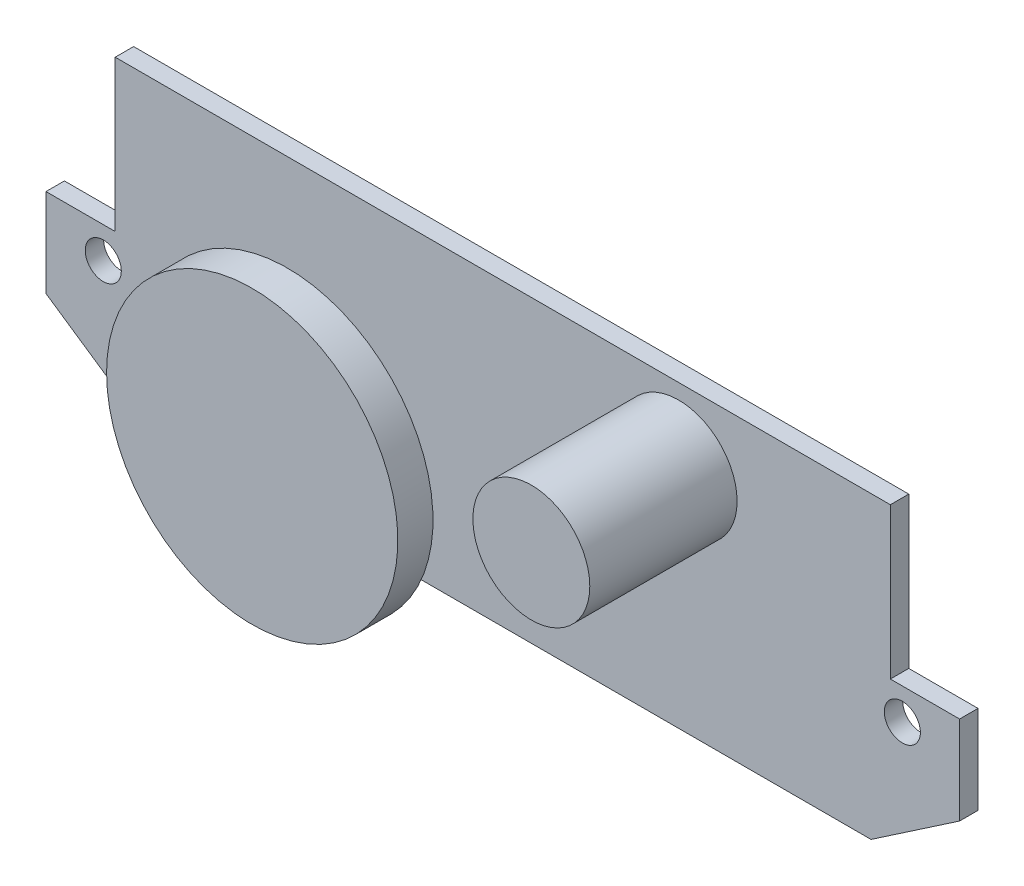
ISO-10303-21;
HEADER;
FILE_DESCRIPTION(('STEP AP214'),'2;1');
FILE_NAME('part.step','',(''),(''),'','','');
FILE_SCHEMA(('AUTOMOTIVE_DESIGN { 1 0 10303 214 1 1 1 1 }'));
ENDSEC;
DATA;
#1=APPLICATION_CONTEXT('core data for automotive mechanical design processes');
#2=APPLICATION_PROTOCOL_DEFINITION('international standard','automotive_design',2000,#1);
#3=PRODUCT_CONTEXT('',#1,'mechanical');
#4=PRODUCT('Part','Part','',(#3));
#5=PRODUCT_RELATED_PRODUCT_CATEGORY('part','',(#4));
#6=PRODUCT_DEFINITION_FORMATION('','',#4);
#7=PRODUCT_DEFINITION_CONTEXT('part definition',#1,'design');
#8=PRODUCT_DEFINITION('design','',#6,#7);
#9=PRODUCT_DEFINITION_SHAPE('','',#8);
#10=(LENGTH_UNIT() NAMED_UNIT(*) SI_UNIT(.MILLI.,.METRE.));
#11=(NAMED_UNIT(*) PLANE_ANGLE_UNIT() SI_UNIT($,.RADIAN.));
#12=(NAMED_UNIT(*) SI_UNIT($,.STERADIAN.) SOLID_ANGLE_UNIT());
#13=UNCERTAINTY_MEASURE_WITH_UNIT(LENGTH_MEASURE(1.E-05),#10,'distance_accuracy_value','');
#14=(GEOMETRIC_REPRESENTATION_CONTEXT(3) GLOBAL_UNCERTAINTY_ASSIGNED_CONTEXT((#13)) GLOBAL_UNIT_ASSIGNED_CONTEXT((#10,
#11,#12)) REPRESENTATION_CONTEXT('',''));
#15=CARTESIAN_POINT('',(0.,0.,0.));
#16=DIRECTION('',(0.,0.,1.));
#17=DIRECTION('',(1.,0.,0.));
#18=AXIS2_PLACEMENT_3D('',#15,#16,#17);
#19=CARTESIAN_POINT('',(0.,0.,1.));
#20=DIRECTION('',(0.,-1.,0.));
#21=DIRECTION('',(1.,0.,0.));
#22=AXIS2_PLACEMENT_3D('',#19,#20,#21);
#23=PLANE('',#22);
#24=DIRECTION('',(-1.,0.,0.));
#25=VECTOR('',#24,1.);
#26=CARTESIAN_POINT('',(0.,0.,0.));
#27=LINE('',#26,#25);
#28=CARTESIAN_POINT('',(21.05,0.,0.));
#29=VERTEX_POINT('',#28);
#30=CARTESIAN_POINT('',(-21.05,0.,0.));
#31=VERTEX_POINT('',#30);
#32=EDGE_CURVE('E153',#29,#31,#27,.T.);
#33=ORIENTED_EDGE('',*,*,#32,.T.);
#34=DIRECTION('',(0.,0.,-1.));
#35=VECTOR('',#34,1.);
#36=CARTESIAN_POINT('',(-21.05,0.,1.));
#37=LINE('',#36,#35);
#38=CARTESIAN_POINT('',(-21.05,0.,1.));
#39=VERTEX_POINT('',#38);
#40=EDGE_CURVE('E40',#39,#31,#37,.T.);
#41=ORIENTED_EDGE('',*,*,#40,.F.);
#42=DIRECTION('',(-1.,0.,0.));
#43=VECTOR('',#42,1.);
#44=CARTESIAN_POINT('',(0.,0.,1.));
#45=LINE('',#44,#43);
#46=CARTESIAN_POINT('',(21.05,0.,1.));
#47=VERTEX_POINT('',#46);
#48=EDGE_CURVE('E176',#47,#39,#45,.T.);
#49=ORIENTED_EDGE('',*,*,#48,.F.);
#50=DIRECTION('',(0.,0.,-1.));
#51=VECTOR('',#50,1.);
#52=CARTESIAN_POINT('',(21.05,0.,1.));
#53=LINE('',#52,#51);
#54=EDGE_CURVE('E55',#47,#29,#53,.T.);
#55=ORIENTED_EDGE('',*,*,#54,.T.);
#56=EDGE_LOOP('',(#33,#41,#49,#55));
#57=FACE_BOUND('',#56,.T.);
#58=ADVANCED_FACE('F33',(#57),#23,.F.);
#59=CARTESIAN_POINT('',(-21.05,0.,1.));
#60=DIRECTION('',(1.,0.,0.));
#61=DIRECTION('',(0.,0.,-1.));
#62=AXIS2_PLACEMENT_3D('',#59,#60,#61);
#63=PLANE('',#62);
#64=DIRECTION('',(0.,-1.,0.));
#65=VECTOR('',#64,1.);
#66=CARTESIAN_POINT('',(-21.05,0.,0.));
#67=LINE('',#66,#65);
#68=CARTESIAN_POINT('',(-21.05,-8.2,0.));
#69=VERTEX_POINT('',#68);
#70=EDGE_CURVE('E155',#31,#69,#67,.T.);
#71=ORIENTED_EDGE('',*,*,#70,.T.);
#72=DIRECTION('',(0.,0.,-1.));
#73=VECTOR('',#72,1.);
#74=CARTESIAN_POINT('',(-21.05,-8.2,1.));
#75=LINE('',#74,#73);
#76=CARTESIAN_POINT('',(-21.05,-8.2,1.));
#77=VERTEX_POINT('',#76);
#78=EDGE_CURVE('E191',#77,#69,#75,.T.);
#79=ORIENTED_EDGE('',*,*,#78,.F.);
#80=DIRECTION('',(0.,-1.,0.));
#81=VECTOR('',#80,1.);
#82=CARTESIAN_POINT('',(-21.05,0.,1.));
#83=LINE('',#82,#81);
#84=EDGE_CURVE('E101',#39,#77,#83,.T.);
#85=ORIENTED_EDGE('',*,*,#84,.F.);
#86=ORIENTED_EDGE('',*,*,#40,.T.);
#87=EDGE_LOOP('',(#71,#79,#85,#86));
#88=FACE_BOUND('',#87,.T.);
#89=ADVANCED_FACE('F194',(#88),#63,.F.);
#90=CARTESIAN_POINT('',(0.,-8.2,1.));
#91=DIRECTION('',(0.,-1.,0.));
#92=DIRECTION('',(0.,0.,-1.));
#93=AXIS2_PLACEMENT_3D('',#90,#91,#92);
#94=PLANE('',#93);
#95=DIRECTION('',(-1.,0.,0.));
#96=VECTOR('',#95,1.);
#97=CARTESIAN_POINT('',(0.,-8.2,0.));
#98=LINE('',#97,#96);
#99=CARTESIAN_POINT('',(-24.81,-8.2,0.));
#100=VERTEX_POINT('',#99);
#101=EDGE_CURVE('E158',#69,#100,#98,.T.);
#102=ORIENTED_EDGE('',*,*,#101,.T.);
#103=DIRECTION('',(0.,0.,-1.));
#104=VECTOR('',#103,1.);
#105=CARTESIAN_POINT('',(-24.81,-8.2,1.));
#106=LINE('',#105,#104);
#107=CARTESIAN_POINT('',(-24.81,-8.2,1.));
#108=VERTEX_POINT('',#107);
#109=EDGE_CURVE('E188',#108,#100,#106,.T.);
#110=ORIENTED_EDGE('',*,*,#109,.F.);
#111=DIRECTION('',(-1.,0.,0.));
#112=VECTOR('',#111,1.);
#113=CARTESIAN_POINT('',(0.,-8.2,1.));
#114=LINE('',#113,#112);
#115=EDGE_CURVE('E226',#77,#108,#114,.T.);
#116=ORIENTED_EDGE('',*,*,#115,.F.);
#117=ORIENTED_EDGE('',*,*,#78,.T.);
#118=EDGE_LOOP('',(#102,#110,#116,#117));
#119=FACE_BOUND('',#118,.T.);
#120=ADVANCED_FACE('F225',(#119),#94,.F.);
#121=CARTESIAN_POINT('',(-24.81,0.,1.));
#122=DIRECTION('',(1.,0.,0.));
#123=DIRECTION('',(0.,0.,-1.));
#124=AXIS2_PLACEMENT_3D('',#121,#122,#123);
#125=PLANE('',#124);
#126=DIRECTION('',(0.,-1.,0.));
#127=VECTOR('',#126,1.);
#128=CARTESIAN_POINT('',(-24.81,0.,0.));
#129=LINE('',#128,#127);
#130=CARTESIAN_POINT('',(-24.81,-13.,0.));
#131=VERTEX_POINT('',#130);
#132=EDGE_CURVE('E160',#100,#131,#129,.T.);
#133=ORIENTED_EDGE('',*,*,#132,.T.);
#134=DIRECTION('',(0.,0.,-1.));
#135=VECTOR('',#134,1.);
#136=CARTESIAN_POINT('',(-24.81,-13.,1.));
#137=LINE('',#136,#135);
#138=CARTESIAN_POINT('',(-24.81,-13.,1.));
#139=VERTEX_POINT('',#138);
#140=EDGE_CURVE('E185',#139,#131,#137,.T.);
#141=ORIENTED_EDGE('',*,*,#140,.F.);
#142=DIRECTION('',(0.,-1.,0.));
#143=VECTOR('',#142,1.);
#144=CARTESIAN_POINT('',(-24.81,0.,1.));
#145=LINE('',#144,#143);
#146=EDGE_CURVE('E222',#108,#139,#145,.T.);
#147=ORIENTED_EDGE('',*,*,#146,.F.);
#148=ORIENTED_EDGE('',*,*,#109,.T.);
#149=EDGE_LOOP('',(#133,#141,#147,#148));
#150=FACE_BOUND('',#149,.T.);
#151=ADVANCED_FACE('F219',(#150),#125,.F.);
#152=CARTESIAN_POINT('',(-13.8864272961069,-20.4262126282184,1.));
#153=DIRECTION('',(0.562215963345948,0.826990453729054,0.));
#154=DIRECTION('',(-0.826990453729054,0.562215963345948,0.));
#155=AXIS2_PLACEMENT_3D('',#152,#153,#154);
#156=PLANE('',#155);
#157=DIRECTION('',(0.826990453729054,-0.562215963345948,0.));
#158=VECTOR('',#157,1.);
#159=CARTESIAN_POINT('',(-13.8864272961069,-20.4262126282184,0.));
#160=LINE('',#159,#158);
#161=CARTESIAN_POINT('',(-20.,-16.27,0.));
#162=VERTEX_POINT('',#161);
#163=EDGE_CURVE('E162',#131,#162,#160,.T.);
#164=ORIENTED_EDGE('',*,*,#163,.T.);
#165=DIRECTION('',(0.,0.,-1.));
#166=VECTOR('',#165,1.);
#167=CARTESIAN_POINT('',(-20.,-16.27,1.));
#168=LINE('',#167,#166);
#169=CARTESIAN_POINT('',(-20.,-16.27,1.));
#170=VERTEX_POINT('',#169);
#171=EDGE_CURVE('E182',#170,#162,#168,.T.);
#172=ORIENTED_EDGE('',*,*,#171,.F.);
#173=DIRECTION('',(0.826990453729054,-0.562215963345948,0.));
#174=VECTOR('',#173,1.);
#175=CARTESIAN_POINT('',(-13.8864272961069,-20.4262126282184,1.));
#176=LINE('',#175,#174);
#177=EDGE_CURVE('E215',#139,#170,#176,.T.);
#178=ORIENTED_EDGE('',*,*,#177,.F.);
#179=ORIENTED_EDGE('',*,*,#140,.T.);
#180=EDGE_LOOP('',(#164,#172,#178,#179));
#181=FACE_BOUND('',#180,.T.);
#182=ADVANCED_FACE('F214',(#181),#156,.F.);
#183=CARTESIAN_POINT('',(0.,-16.27,1.));
#184=DIRECTION('',(0.,1.,0.));
#185=DIRECTION('',(-1.,0.,0.));
#186=AXIS2_PLACEMENT_3D('',#183,#184,#185);
#187=PLANE('',#186);
#188=DIRECTION('',(1.,0.,0.));
#189=VECTOR('',#188,1.);
#190=CARTESIAN_POINT('',(0.,-16.27,0.));
#191=LINE('',#190,#189);
#192=CARTESIAN_POINT('',(20.,-16.27,0.));
#193=VERTEX_POINT('',#192);
#194=EDGE_CURVE('E164',#162,#193,#191,.T.);
#195=ORIENTED_EDGE('',*,*,#194,.T.);
#196=DIRECTION('',(0.,0.,-1.));
#197=VECTOR('',#196,1.);
#198=CARTESIAN_POINT('',(20.,-16.27,1.));
#199=LINE('',#198,#197);
#200=CARTESIAN_POINT('',(20.,-16.27,1.));
#201=VERTEX_POINT('',#200);
#202=EDGE_CURVE('E180',#201,#193,#199,.T.);
#203=ORIENTED_EDGE('',*,*,#202,.F.);
#204=DIRECTION('',(1.,0.,0.));
#205=VECTOR('',#204,1.);
#206=CARTESIAN_POINT('',(0.,-16.27,1.));
#207=LINE('',#206,#205);
#208=CARTESIAN_POINT('',(-8.55096697834907,-16.27,0.999999999976353));
#209=VERTEX_POINT('',#208);
#210=EDGE_CURVE('E233',#209,#201,#207,.T.);
#211=ORIENTED_EDGE('',*,*,#210,.F.);
#212=CARTESIAN_POINT('',(-11.5490330216509,-16.27,1.));
#213=VERTEX_POINT('',#212);
#214=EDGE_CURVE('E234',#213,#209,#207,.T.);
#215=ORIENTED_EDGE('',*,*,#214,.F.);
#216=EDGE_CURVE('E211',#170,#213,#207,.T.);
#217=ORIENTED_EDGE('',*,*,#216,.F.);
#218=ORIENTED_EDGE('',*,*,#171,.T.);
#219=EDGE_LOOP('',(#195,#203,#211,#215,#217,#218));
#220=FACE_BOUND('',#219,.T.);
#221=ADVANCED_FACE('F207',(#220),#187,.F.);
#222=CARTESIAN_POINT('',(13.8864272961069,-20.4262126282184,1.));
#223=DIRECTION('',(0.562215963345949,-0.826990453729054,0.));
#224=DIRECTION('',(0.826990453729054,0.562215963345949,0.));
#225=AXIS2_PLACEMENT_3D('',#222,#223,#224);
#226=PLANE('',#225);
#227=DIRECTION('',(-0.826990453729054,-0.562215963345949,0.));
#228=VECTOR('',#227,1.);
#229=CARTESIAN_POINT('',(13.8864272961069,-20.4262126282184,0.));
#230=LINE('',#229,#228);
#231=CARTESIAN_POINT('',(24.81,-13.,0.));
#232=VERTEX_POINT('',#231);
#233=EDGE_CURVE('E167',#232,#193,#230,.T.);
#234=ORIENTED_EDGE('',*,*,#233,.F.);
#235=DIRECTION('',(0.,0.,-1.));
#236=VECTOR('',#235,1.);
#237=CARTESIAN_POINT('',(24.81,-13.,1.));
#238=LINE('',#237,#236);
#239=CARTESIAN_POINT('',(24.81,-13.,1.));
#240=VERTEX_POINT('',#239);
#241=EDGE_CURVE('E134',#240,#232,#238,.T.);
#242=ORIENTED_EDGE('',*,*,#241,.F.);
#243=DIRECTION('',(-0.826990453729054,-0.562215963345949,0.));
#244=VECTOR('',#243,1.);
#245=CARTESIAN_POINT('',(13.8864272961069,-20.4262126282184,1.));
#246=LINE('',#245,#244);
#247=EDGE_CURVE('E145',#240,#201,#246,.T.);
#248=ORIENTED_EDGE('',*,*,#247,.T.);
#249=ORIENTED_EDGE('',*,*,#202,.T.);
#250=EDGE_LOOP('',(#234,#242,#248,#249));
#251=FACE_BOUND('',#250,.T.);
#252=ADVANCED_FACE('F203',(#251),#226,.T.);
#253=CARTESIAN_POINT('',(24.81,0.,1.));
#254=DIRECTION('',(1.,0.,0.));
#255=DIRECTION('',(0.,0.,-1.));
#256=AXIS2_PLACEMENT_3D('',#253,#254,#255);
#257=PLANE('',#256);
#258=DIRECTION('',(0.,-1.,0.));
#259=VECTOR('',#258,1.);
#260=CARTESIAN_POINT('',(24.81,0.,0.));
#261=LINE('',#260,#259);
#262=CARTESIAN_POINT('',(24.81,-8.19999999999999,0.));
#263=VERTEX_POINT('',#262);
#264=EDGE_CURVE('E129',#263,#232,#261,.T.);
#265=ORIENTED_EDGE('',*,*,#264,.F.);
#266=DIRECTION('',(0.,0.,-1.));
#267=VECTOR('',#266,1.);
#268=CARTESIAN_POINT('',(24.81,-8.19999999999999,1.));
#269=LINE('',#268,#267);
#270=CARTESIAN_POINT('',(24.81,-8.19999999999999,1.));
#271=VERTEX_POINT('',#270);
#272=EDGE_CURVE('E124',#271,#263,#269,.T.);
#273=ORIENTED_EDGE('',*,*,#272,.F.);
#274=DIRECTION('',(0.,-1.,0.));
#275=VECTOR('',#274,1.);
#276=CARTESIAN_POINT('',(24.81,0.,1.));
#277=LINE('',#276,#275);
#278=EDGE_CURVE('E127',#271,#240,#277,.T.);
#279=ORIENTED_EDGE('',*,*,#278,.T.);
#280=ORIENTED_EDGE('',*,*,#241,.T.);
#281=EDGE_LOOP('',(#265,#273,#279,#280));
#282=FACE_BOUND('',#281,.T.);
#283=ADVANCED_FACE('F126',(#282),#257,.T.);
#284=CARTESIAN_POINT('',(0.,-8.20000000000002,1.));
#285=DIRECTION('',(0.,1.,0.));
#286=DIRECTION('',(-1.,0.,0.));
#287=AXIS2_PLACEMENT_3D('',#284,#285,#286);
#288=PLANE('',#287);
#289=DIRECTION('',(1.,0.,0.));
#290=VECTOR('',#289,1.);
#291=CARTESIAN_POINT('',(0.,-8.20000000000002,0.));
#292=LINE('',#291,#290);
#293=CARTESIAN_POINT('',(21.05,-8.2,0.));
#294=VERTEX_POINT('',#293);
#295=EDGE_CURVE('E171',#294,#263,#292,.T.);
#296=ORIENTED_EDGE('',*,*,#295,.F.);
#297=DIRECTION('',(0.,0.,-1.));
#298=VECTOR('',#297,1.);
#299=CARTESIAN_POINT('',(21.05,-8.2,1.));
#300=LINE('',#299,#298);
#301=CARTESIAN_POINT('',(21.05,-8.2,1.));
#302=VERTEX_POINT('',#301);
#303=EDGE_CURVE('E135',#302,#294,#300,.T.);
#304=ORIENTED_EDGE('',*,*,#303,.F.);
#305=DIRECTION('',(1.,0.,0.));
#306=VECTOR('',#305,1.);
#307=CARTESIAN_POINT('',(0.,-8.20000000000002,1.));
#308=LINE('',#307,#306);
#309=EDGE_CURVE('E143',#302,#271,#308,.T.);
#310=ORIENTED_EDGE('',*,*,#309,.T.);
#311=ORIENTED_EDGE('',*,*,#272,.T.);
#312=EDGE_LOOP('',(#296,#304,#310,#311));
#313=FACE_BOUND('',#312,.T.);
#314=ADVANCED_FACE('F147',(#313),#288,.T.);
#315=CARTESIAN_POINT('',(21.05,0.,1.));
#316=DIRECTION('',(1.,0.,0.));
#317=DIRECTION('',(0.,0.,-1.));
#318=AXIS2_PLACEMENT_3D('',#315,#316,#317);
#319=PLANE('',#318);
#320=DIRECTION('',(0.,-1.,0.));
#321=VECTOR('',#320,1.);
#322=CARTESIAN_POINT('',(21.05,0.,0.));
#323=LINE('',#322,#321);
#324=EDGE_CURVE('E173',#29,#294,#323,.T.);
#325=ORIENTED_EDGE('',*,*,#324,.F.);
#326=ORIENTED_EDGE('',*,*,#54,.F.);
#327=DIRECTION('',(0.,-1.,0.));
#328=VECTOR('',#327,1.);
#329=CARTESIAN_POINT('',(21.05,0.,1.));
#330=LINE('',#329,#328);
#331=EDGE_CURVE('E148',#47,#302,#330,.T.);
#332=ORIENTED_EDGE('',*,*,#331,.T.);
#333=ORIENTED_EDGE('',*,*,#303,.T.);
#334=EDGE_LOOP('',(#325,#326,#332,#333));
#335=FACE_BOUND('',#334,.T.);
#336=ADVANCED_FACE('F198',(#335),#319,.T.);
#337=CARTESIAN_POINT('',(0.,0.,1.));
#338=DIRECTION('',(0.,0.,1.));
#339=DIRECTION('',(1.,0.,0.));
#340=AXIS2_PLACEMENT_3D('',#337,#338,#339);
#341=PLANE('',#340);
#342=CARTESIAN_POINT('',(9.55,-4.,1.));
#343=DIRECTION('',(0.,0.,1.));
#344=DIRECTION('',(1.,0.,0.));
#345=AXIS2_PLACEMENT_3D('',#342,#343,#344);
#346=CIRCLE('',#345,3.175);
#347=CARTESIAN_POINT('',(12.725,-4.,1.));
#348=VERTEX_POINT('',#347);
#349=EDGE_CURVE('E241',#348,#348,#346,.T.);
#350=ORIENTED_EDGE('',*,*,#349,.F.);
#351=EDGE_LOOP('',(#350));
#352=FACE_BOUND('',#351,.T.);
#353=CARTESIAN_POINT('',(-21.7,-9.90000000000001,1.));
#354=DIRECTION('',(0.,0.,1.));
#355=DIRECTION('',(1.,0.,0.));
#356=AXIS2_PLACEMENT_3D('',#353,#354,#355);
#357=CIRCLE('',#356,0.980000000000002);
#358=CARTESIAN_POINT('',(-20.72,-9.90000000000001,1.));
#359=VERTEX_POINT('',#358);
#360=EDGE_CURVE('E254',#359,#359,#357,.T.);
#361=ORIENTED_EDGE('',*,*,#360,.F.);
#362=EDGE_LOOP('',(#361));
#363=FACE_BOUND('',#362,.T.);
#364=CARTESIAN_POINT('',(21.7,-9.9,1.));
#365=DIRECTION('',(0.,0.,1.));
#366=DIRECTION('',(-1.,0.,0.));
#367=AXIS2_PLACEMENT_3D('',#364,#365,#366);
#368=CIRCLE('',#367,0.980000000000002);
#369=CARTESIAN_POINT('',(20.72,-9.9,1.));
#370=VERTEX_POINT('',#369);
#371=EDGE_CURVE('E251',#370,#370,#368,.T.);
#372=ORIENTED_EDGE('',*,*,#371,.F.);
#373=EDGE_LOOP('',(#372));
#374=FACE_BOUND('',#373,.T.);
#375=ORIENTED_EDGE('',*,*,#216,.T.);
#376=CARTESIAN_POINT('',(-10.05,-11.5,0.999999999976353));
#377=DIRECTION('',(0.,0.,1.));
#378=DIRECTION('',(1.,0.,0.));
#379=AXIS2_PLACEMENT_3D('',#376,#377,#378);
#380=CIRCLE('',#379,5.);
#381=EDGE_CURVE('E11',#213,#209,#380,.F.);
#382=ORIENTED_EDGE('',*,*,#381,.T.);
#383=ORIENTED_EDGE('',*,*,#210,.T.);
#384=ORIENTED_EDGE('',*,*,#247,.F.);
#385=ORIENTED_EDGE('',*,*,#278,.F.);
#386=ORIENTED_EDGE('',*,*,#309,.F.);
#387=ORIENTED_EDGE('',*,*,#331,.F.);
#388=ORIENTED_EDGE('',*,*,#48,.T.);
#389=ORIENTED_EDGE('',*,*,#84,.T.);
#390=ORIENTED_EDGE('',*,*,#115,.T.);
#391=ORIENTED_EDGE('',*,*,#146,.T.);
#392=ORIENTED_EDGE('',*,*,#177,.T.);
#393=EDGE_LOOP('',(#375,#382,#383,#384,#385,#386,#387,#388,#389,#390,#391,#392));
#394=FACE_BOUND('',#393,.T.);
#395=ADVANCED_FACE('F141',(#352,#363,#374,#394),#341,.T.);
#396=CARTESIAN_POINT('',(0.,0.,0.));
#397=DIRECTION('',(0.,0.,1.));
#398=DIRECTION('',(1.,0.,0.));
#399=AXIS2_PLACEMENT_3D('',#396,#397,#398);
#400=PLANE('',#399);
#401=CARTESIAN_POINT('',(-21.7,-9.90000000000001,0.));
#402=DIRECTION('',(0.,0.,1.));
#403=DIRECTION('',(1.,0.,0.));
#404=AXIS2_PLACEMENT_3D('',#401,#402,#403);
#405=CIRCLE('',#404,0.980000000000002);
#406=CARTESIAN_POINT('',(-20.72,-9.90000000000001,0.));
#407=VERTEX_POINT('',#406);
#408=EDGE_CURVE('E156',#407,#407,#405,.F.);
#409=ORIENTED_EDGE('',*,*,#408,.F.);
#410=EDGE_LOOP('',(#409));
#411=FACE_BOUND('',#410,.T.);
#412=CARTESIAN_POINT('',(21.7,-9.9,0.));
#413=DIRECTION('',(0.,0.,1.));
#414=DIRECTION('',(1.,0.,0.));
#415=AXIS2_PLACEMENT_3D('',#412,#413,#414);
#416=CIRCLE('',#415,0.980000000000002);
#417=CARTESIAN_POINT('',(22.68,-9.9,0.));
#418=VERTEX_POINT('',#417);
#419=EDGE_CURVE('E257',#418,#418,#416,.F.);
#420=ORIENTED_EDGE('',*,*,#419,.F.);
#421=EDGE_LOOP('',(#420));
#422=FACE_BOUND('',#421,.T.);
#423=ORIENTED_EDGE('',*,*,#32,.F.);
#424=ORIENTED_EDGE('',*,*,#324,.T.);
#425=ORIENTED_EDGE('',*,*,#295,.T.);
#426=ORIENTED_EDGE('',*,*,#264,.T.);
#427=ORIENTED_EDGE('',*,*,#233,.T.);
#428=ORIENTED_EDGE('',*,*,#194,.F.);
#429=ORIENTED_EDGE('',*,*,#163,.F.);
#430=ORIENTED_EDGE('',*,*,#132,.F.);
#431=ORIENTED_EDGE('',*,*,#101,.F.);
#432=ORIENTED_EDGE('',*,*,#70,.F.);
#433=EDGE_LOOP('',(#423,#424,#425,#426,#427,#428,#429,#430,#431,#432));
#434=FACE_BOUND('',#433,.T.);
#435=ADVANCED_FACE('F196',(#411,#422,#434),#400,.F.);
#436=CARTESIAN_POINT('',(21.7,-9.9,-0.000999999999999916));
#437=DIRECTION('',(0.,0.,1.));
#438=DIRECTION('',(1.,0.,0.));
#439=AXIS2_PLACEMENT_3D('',#436,#437,#438);
#440=CYLINDRICAL_SURFACE('',#439,0.980000000000002);
#441=ORIENTED_EDGE('',*,*,#371,.T.);
#442=EDGE_LOOP('',(#441));
#443=FACE_BOUND('',#442,.T.);
#444=ORIENTED_EDGE('',*,*,#419,.T.);
#445=EDGE_LOOP('',(#444));
#446=FACE_BOUND('',#445,.T.);
#447=ADVANCED_FACE('F265',(#443,#446),#440,.F.);
#448=CARTESIAN_POINT('',(-21.7,-9.90000000000001,-0.000999999999999916));
#449=DIRECTION('',(0.,0.,1.));
#450=DIRECTION('',(1.,0.,0.));
#451=AXIS2_PLACEMENT_3D('',#448,#449,#450);
#452=CYLINDRICAL_SURFACE('',#451,0.980000000000002);
#453=ORIENTED_EDGE('',*,*,#360,.T.);
#454=EDGE_LOOP('',(#453));
#455=FACE_BOUND('',#454,.T.);
#456=ORIENTED_EDGE('',*,*,#408,.T.);
#457=EDGE_LOOP('',(#456));
#458=FACE_BOUND('',#457,.T.);
#459=ADVANCED_FACE('F274',(#455,#458),#452,.F.);
#460=CARTESIAN_POINT('',(9.55,-4.,9.));
#461=DIRECTION('',(0.,0.,-1.));
#462=DIRECTION('',(-1.,0.,0.));
#463=AXIS2_PLACEMENT_3D('',#460,#461,#462);
#464=CYLINDRICAL_SURFACE('',#463,3.175);
#465=CARTESIAN_POINT('',(9.55,-4.,9.));
#466=DIRECTION('',(0.,0.,1.));
#467=DIRECTION('',(1.,0.,0.));
#468=AXIS2_PLACEMENT_3D('',#465,#466,#467);
#469=CIRCLE('',#468,3.175);
#470=CARTESIAN_POINT('',(12.725,-4.,9.));
#471=VERTEX_POINT('',#470);
#472=EDGE_CURVE('E248',#471,#471,#469,.T.);
#473=ORIENTED_EDGE('',*,*,#472,.F.);
#474=EDGE_LOOP('',(#473));
#475=FACE_BOUND('',#474,.T.);
#476=ORIENTED_EDGE('',*,*,#349,.T.);
#477=EDGE_LOOP('',(#476));
#478=FACE_BOUND('',#477,.T.);
#479=ADVANCED_FACE('F373',(#475,#478),#464,.T.);
#480=CARTESIAN_POINT('',(9.55,-4.,9.));
#481=DIRECTION('',(0.,0.,1.));
#482=DIRECTION('',(1.,0.,0.));
#483=AXIS2_PLACEMENT_3D('',#480,#481,#482);
#484=PLANE('',#483);
#485=ORIENTED_EDGE('',*,*,#472,.T.);
#486=EDGE_LOOP('',(#485));
#487=FACE_BOUND('',#486,.T.);
#488=ADVANCED_FACE('F326',(#487),#484,.T.);
#489=CARTESIAN_POINT('',(-10.05,-11.5,1.));
#490=DIRECTION('',(0.,0.,1.));
#491=DIRECTION('',(1.,0.,0.));
#492=AXIS2_PLACEMENT_3D('',#489,#490,#491);
#493=PLANE('',#492);
#494=CARTESIAN_POINT('',(-10.05,-11.5,1.));
#495=DIRECTION('',(0.,0.,1.));
#496=DIRECTION('',(1.,0.,0.));
#497=AXIS2_PLACEMENT_3D('',#494,#495,#496);
#498=CIRCLE('',#497,5.);
#499=EDGE_CURVE('E46',#213,#209,#498,.T.);
#500=ORIENTED_EDGE('',*,*,#499,.F.);
#501=ORIENTED_EDGE('',*,*,#214,.T.);
#502=EDGE_LOOP('',(#500,#501));
#503=FACE_BOUND('',#502,.T.);
#504=ADVANCED_FACE('F236',(#503),#493,.F.);
#505=CARTESIAN_POINT('',(-10.05,-11.5,500000.));
#506=DIRECTION('',(0.,0.,-1.));
#507=DIRECTION('',(-1.,0.,0.));
#508=AXIS2_PLACEMENT_3D('',#505,#506,#507);
#509=CYLINDRICAL_SURFACE('',#508,5.);
#510=ORIENTED_EDGE('',*,*,#499,.T.);
#511=ORIENTED_EDGE('',*,*,#381,.F.);
#512=EDGE_LOOP('',(#510,#511));
#513=FACE_BOUND('',#512,.T.);
#514=CARTESIAN_POINT('',(-10.05,-11.5,2.65000000001692));
#515=DIRECTION('',(0.,0.,1.));
#516=DIRECTION('',(1.,0.,0.));
#517=AXIS2_PLACEMENT_3D('',#514,#515,#516);
#518=CIRCLE('',#517,5.);
#519=CARTESIAN_POINT('',(-5.05,-11.5,2.65000000001692));
#520=VERTEX_POINT('',#519);
#521=EDGE_CURVE('E237',#520,#520,#518,.T.);
#522=ORIENTED_EDGE('',*,*,#521,.F.);
#523=EDGE_LOOP('',(#522));
#524=FACE_BOUND('',#523,.T.);
#525=ADVANCED_FACE('F325',(#513,#524),#509,.T.);
#526=CARTESIAN_POINT('',(-10.05,-11.5,4.56));
#527=DIRECTION('',(0.,0.,-1.));
#528=DIRECTION('',(-1.,0.,0.));
#529=AXIS2_PLACEMENT_3D('',#526,#527,#528);
#530=CYLINDRICAL_SURFACE('',#529,7.91);
#531=CARTESIAN_POINT('',(-10.05,-11.5,4.56));
#532=DIRECTION('',(0.,0.,1.));
#533=DIRECTION('',(1.,0.,0.));
#534=AXIS2_PLACEMENT_3D('',#531,#532,#533);
#535=CIRCLE('',#534,7.91);
#536=CARTESIAN_POINT('',(-17.96,-11.5,4.56));
#537=VERTEX_POINT('',#536);
#538=EDGE_CURVE('E238',#537,#537,#535,.T.);
#539=CARTESIAN_POINT('',(-10.05,-11.5,2.65));
#540=DIRECTION('',(0.,0.,1.));
#541=DIRECTION('',(1.,0.,0.));
#542=AXIS2_PLACEMENT_3D('',#539,#540,#541);
#543=CIRCLE('',#542,7.91);
#544=CARTESIAN_POINT('',(-17.96,-11.5,2.65));
#545=VERTEX_POINT('',#544);
#546=EDGE_CURVE('E244',#545,#545,#543,.T.);
#547=CARTESIAN_POINT('',(-17.96,-11.5,4.56));
#548=CARTESIAN_POINT('',(-17.96,-11.5,4.54010416666667));
#549=CARTESIAN_POINT('',(-17.96,-11.5,4.52020833333333));
#550=CARTESIAN_POINT('',(-17.96,-11.5,4.48041666666667));
#551=CARTESIAN_POINT('',(-17.96,-11.5,4.46052083333333));
#552=CARTESIAN_POINT('',(-17.96,-11.5,4.42072916666667));
#553=CARTESIAN_POINT('',(-17.96,-11.5,4.40083333333333));
#554=CARTESIAN_POINT('',(-17.96,-11.5,4.36104166666667));
#555=CARTESIAN_POINT('',(-17.96,-11.5,4.34114583333333));
#556=CARTESIAN_POINT('',(-17.96,-11.5,4.30135416666667));
#557=CARTESIAN_POINT('',(-17.96,-11.5,4.28145833333333));
#558=CARTESIAN_POINT('',(-17.96,-11.5,4.24166666666667));
#559=CARTESIAN_POINT('',(-17.96,-11.5,4.22177083333333));
#560=CARTESIAN_POINT('',(-17.96,-11.5,4.18197916666667));
#561=CARTESIAN_POINT('',(-17.96,-11.5,4.16208333333333));
#562=CARTESIAN_POINT('',(-17.96,-11.5,4.12229166666667));
#563=CARTESIAN_POINT('',(-17.96,-11.5,4.10239583333333));
#564=CARTESIAN_POINT('',(-17.96,-11.5,4.06260416666667));
#565=CARTESIAN_POINT('',(-17.96,-11.5,4.04270833333333));
#566=CARTESIAN_POINT('',(-17.96,-11.5,4.00291666666667));
#567=CARTESIAN_POINT('',(-17.96,-11.5,3.98302083333333));
#568=CARTESIAN_POINT('',(-17.96,-11.5,3.94322916666667));
#569=CARTESIAN_POINT('',(-17.96,-11.5,3.92333333333333));
#570=CARTESIAN_POINT('',(-17.96,-11.5,3.88354166666667));
#571=CARTESIAN_POINT('',(-17.96,-11.5,3.86364583333333));
#572=CARTESIAN_POINT('',(-17.96,-11.5,3.82385416666667));
#573=CARTESIAN_POINT('',(-17.96,-11.5,3.80395833333333));
#574=CARTESIAN_POINT('',(-17.96,-11.5,3.76416666666667));
#575=CARTESIAN_POINT('',(-17.96,-11.5,3.74427083333333));
#576=CARTESIAN_POINT('',(-17.96,-11.5,3.70447916666667));
#577=CARTESIAN_POINT('',(-17.96,-11.5,3.68458333333333));
#578=CARTESIAN_POINT('',(-17.96,-11.5,3.64479166666667));
#579=CARTESIAN_POINT('',(-17.96,-11.5,3.62489583333333));
#580=CARTESIAN_POINT('',(-17.96,-11.5,3.58510416666667));
#581=CARTESIAN_POINT('',(-17.96,-11.5,3.56520833333333));
#582=CARTESIAN_POINT('',(-17.96,-11.5,3.52541666666667));
#583=CARTESIAN_POINT('',(-17.96,-11.5,3.50552083333333));
#584=CARTESIAN_POINT('',(-17.96,-11.5,3.46572916666667));
#585=CARTESIAN_POINT('',(-17.96,-11.5,3.44583333333333));
#586=CARTESIAN_POINT('',(-17.96,-11.5,3.40604166666667));
#587=CARTESIAN_POINT('',(-17.96,-11.5,3.38614583333333));
#588=CARTESIAN_POINT('',(-17.96,-11.5,3.34635416666667));
#589=CARTESIAN_POINT('',(-17.96,-11.5,3.32645833333333));
#590=CARTESIAN_POINT('',(-17.96,-11.5,3.28666666666667));
#591=CARTESIAN_POINT('',(-17.96,-11.5,3.26677083333333));
#592=CARTESIAN_POINT('',(-17.96,-11.5,3.22697916666667));
#593=CARTESIAN_POINT('',(-17.96,-11.5,3.20708333333333));
#594=CARTESIAN_POINT('',(-17.96,-11.5,3.16729166666667));
#595=CARTESIAN_POINT('',(-17.96,-11.5,3.14739583333333));
#596=CARTESIAN_POINT('',(-17.96,-11.5,3.10760416666667));
#597=CARTESIAN_POINT('',(-17.96,-11.5,3.08770833333333));
#598=CARTESIAN_POINT('',(-17.96,-11.5,3.04791666666667));
#599=CARTESIAN_POINT('',(-17.96,-11.5,3.02802083333333));
#600=CARTESIAN_POINT('',(-17.96,-11.5,2.98822916666667));
#601=CARTESIAN_POINT('',(-17.96,-11.5,2.96833333333333));
#602=CARTESIAN_POINT('',(-17.96,-11.5,2.92854166666667));
#603=CARTESIAN_POINT('',(-17.96,-11.5,2.90864583333333));
#604=CARTESIAN_POINT('',(-17.96,-11.5,2.86885416666667));
#605=CARTESIAN_POINT('',(-17.96,-11.5,2.84895833333333));
#606=CARTESIAN_POINT('',(-17.96,-11.5,2.80916666666667));
#607=CARTESIAN_POINT('',(-17.96,-11.5,2.78927083333333));
#608=CARTESIAN_POINT('',(-17.96,-11.5,2.74947916666667));
#609=CARTESIAN_POINT('',(-17.96,-11.5,2.72958333333333));
#610=CARTESIAN_POINT('',(-17.96,-11.5,2.68979166666667));
#611=CARTESIAN_POINT('',(-17.96,-11.5,2.66989583333333));
#612=CARTESIAN_POINT('',(-17.96,-11.5,2.65));
#613=B_SPLINE_CURVE_WITH_KNOTS('',3,(#547,#548,#549,#550,#551,#552,#553,#554,#555,#556,#557,
#558,#559,#560,#561,#562,#563,#564,#565,#566,#567,#568,#569,#570,#571,#572,#573,#574,#575,#576,
#577,#578,#579,#580,#581,#582,#583,#584,#585,#586,#587,#588,#589,#590,#591,#592,#593,#594,#595,
#596,#597,#598,#599,#600,#601,#602,#603,#604,#605,#606,#607,#608,#609,#610,#611,#612),
.UNSPECIFIED.,.F.,.F.,(4,2,2,2,2,2,2,2,2,2,2,2,2,2,2,2,2,2,2,2,2,2,2,2,2,2,2,2,2,2,2,2,4),(0.,
0.0596874999999998,0.119375,0.1790625,0.238749999999999,0.298437499999999,0.358124999999999,
0.4178125,0.4775,0.537187499999999,0.596874999999999,0.656562499999999,0.716249999999999,
0.775937499999999,0.835625,0.895312499999999,0.954999999999999,1.0146875,1.074375,1.1340625,
1.19375,1.2534375,1.313125,1.3728125,1.4325,1.4921875,1.551875,1.6115625,1.67125,1.7309375,
1.790625,1.8503125,1.91),.UNSPECIFIED.);
#614=EDGE_CURVE('BSEAM337',#537,#545,#613,.T.);
#615=ORIENTED_EDGE('',*,*,#538,.F.);
#616=ORIENTED_EDGE('',*,*,#546,.T.);
#617=ORIENTED_EDGE('',*,*,#614,.T.);
#618=ORIENTED_EDGE('',*,*,#614,.F.);
#619=EDGE_LOOP('',(#615,#617,#616,#618));
#620=FACE_BOUND('',#619,.T.);
#621=ADVANCED_FACE('F337',(#620),#530,.T.);
#622=CARTESIAN_POINT('',(-10.05,-11.5,4.56));
#623=DIRECTION('',(0.,0.,1.));
#624=DIRECTION('',(1.,0.,0.));
#625=AXIS2_PLACEMENT_3D('',#622,#623,#624);
#626=PLANE('',#625);
#627=ORIENTED_EDGE('',*,*,#538,.T.);
#628=EDGE_LOOP('',(#627));
#629=FACE_BOUND('',#628,.T.);
#630=ADVANCED_FACE('F346',(#629),#626,.T.);
#631=CARTESIAN_POINT('',(-10.05,-11.5,2.65));
#632=DIRECTION('',(0.,0.,1.));
#633=DIRECTION('',(1.,0.,0.));
#634=AXIS2_PLACEMENT_3D('',#631,#632,#633);
#635=PLANE('',#634);
#636=ORIENTED_EDGE('',*,*,#521,.T.);
#637=EDGE_LOOP('',(#636));
#638=FACE_BOUND('',#637,.T.);
#639=ORIENTED_EDGE('',*,*,#546,.F.);
#640=EDGE_LOOP('',(#639));
#641=FACE_BOUND('',#640,.T.);
#642=ADVANCED_FACE('F357',(#638,#641),#635,.F.);
#643=CLOSED_SHELL('',(#58,#89,#120,#151,#182,#221,#252,#283,#314,#336,#395,#435,#447,#459,#479,
#488,#504,#525,#621,#630,#642));
#644=MANIFOLD_SOLID_BREP('B2',#643);
#645=ADVANCED_BREP_SHAPE_REPRESENTATION('',(#18,#644),#14);
#646=SHAPE_DEFINITION_REPRESENTATION(#9,#645);
ENDSEC;
END-ISO-10303-21;
